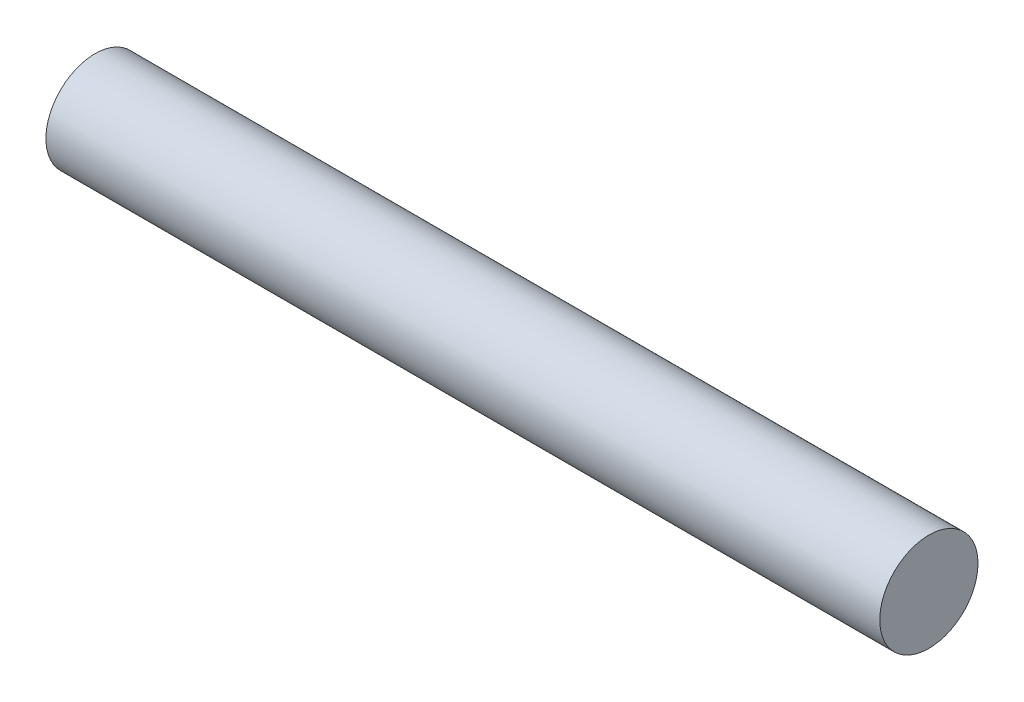
ISO-10303-21;
HEADER;
FILE_DESCRIPTION(('STEP AP214'),'2;1');
FILE_NAME('part.step','',(''),(''),'','','');
FILE_SCHEMA(('AUTOMOTIVE_DESIGN { 1 0 10303 214 1 1 1 1 }'));
ENDSEC;
DATA;
#1=APPLICATION_CONTEXT('core data for automotive mechanical design processes');
#2=APPLICATION_PROTOCOL_DEFINITION('international standard','automotive_design',2000,#1);
#3=PRODUCT_CONTEXT('',#1,'mechanical');
#4=PRODUCT('Part','Part','',(#3));
#5=PRODUCT_RELATED_PRODUCT_CATEGORY('part','',(#4));
#6=PRODUCT_DEFINITION_FORMATION('','',#4);
#7=PRODUCT_DEFINITION_CONTEXT('part definition',#1,'design');
#8=PRODUCT_DEFINITION('design','',#6,#7);
#9=PRODUCT_DEFINITION_SHAPE('','',#8);
#10=(LENGTH_UNIT() NAMED_UNIT(*) SI_UNIT(.MILLI.,.METRE.));
#11=(NAMED_UNIT(*) PLANE_ANGLE_UNIT() SI_UNIT($,.RADIAN.));
#12=(NAMED_UNIT(*) SI_UNIT($,.STERADIAN.) SOLID_ANGLE_UNIT());
#13=UNCERTAINTY_MEASURE_WITH_UNIT(LENGTH_MEASURE(1.E-05),#10,'distance_accuracy_value','');
#14=(GEOMETRIC_REPRESENTATION_CONTEXT(3) GLOBAL_UNCERTAINTY_ASSIGNED_CONTEXT((#13)) GLOBAL_UNIT_ASSIGNED_CONTEXT((#10,
#11,#12)) REPRESENTATION_CONTEXT('',''));
#15=CARTESIAN_POINT('',(0.,0.,0.));
#16=DIRECTION('',(0.,0.,1.));
#17=DIRECTION('',(1.,0.,0.));
#18=AXIS2_PLACEMENT_3D('',#15,#16,#17);
#19=CARTESIAN_POINT('',(67.9,0.,0.));
#20=DIRECTION('',(-1.,0.,0.));
#21=DIRECTION('',(0.,0.,1.));
#22=AXIS2_PLACEMENT_3D('',#19,#20,#21);
#23=CYLINDRICAL_SURFACE('',#22,4.);
#24=CARTESIAN_POINT('',(67.9,0.,0.));
#25=DIRECTION('',(1.,0.,0.));
#26=DIRECTION('',(0.,0.,-1.));
#27=AXIS2_PLACEMENT_3D('',#24,#25,#26);
#28=CIRCLE('',#27,4.);
#29=CARTESIAN_POINT('',(67.9,0.,-4.));
#30=VERTEX_POINT('',#29);
#31=EDGE_CURVE('E10',#30,#30,#28,.T.);
#32=ORIENTED_EDGE('',*,*,#31,.F.);
#33=EDGE_LOOP('',(#32));
#34=FACE_BOUND('',#33,.T.);
#35=CARTESIAN_POINT('',(0.,0.,0.));
#36=DIRECTION('',(1.,0.,0.));
#37=DIRECTION('',(0.,0.,-1.));
#38=AXIS2_PLACEMENT_3D('',#35,#36,#37);
#39=CIRCLE('',#38,4.);
#40=CARTESIAN_POINT('',(0.,0.,-4.));
#41=VERTEX_POINT('',#40);
#42=EDGE_CURVE('E40',#41,#41,#39,.T.);
#43=ORIENTED_EDGE('',*,*,#42,.T.);
#44=EDGE_LOOP('',(#43));
#45=FACE_BOUND('',#44,.T.);
#46=ADVANCED_FACE('F37',(#34,#45),#23,.T.);
#47=CARTESIAN_POINT('',(67.9,0.,0.));
#48=DIRECTION('',(1.,0.,0.));
#49=DIRECTION('',(0.,0.,-1.));
#50=AXIS2_PLACEMENT_3D('',#47,#48,#49);
#51=PLANE('',#50);
#52=ORIENTED_EDGE('',*,*,#31,.T.);
#53=EDGE_LOOP('',(#52));
#54=FACE_BOUND('',#53,.T.);
#55=ADVANCED_FACE('F52',(#54),#51,.T.);
#56=CARTESIAN_POINT('',(0.,0.,0.));
#57=DIRECTION('',(1.,0.,0.));
#58=DIRECTION('',(0.,0.,-1.));
#59=AXIS2_PLACEMENT_3D('',#56,#57,#58);
#60=PLANE('',#59);
#61=ORIENTED_EDGE('',*,*,#42,.F.);
#62=EDGE_LOOP('',(#61));
#63=FACE_BOUND('',#62,.T.);
#64=ADVANCED_FACE('F50',(#63),#60,.F.);
#65=CLOSED_SHELL('',(#46,#55,#64));
#66=MANIFOLD_SOLID_BREP('B2',#65);
#67=ADVANCED_BREP_SHAPE_REPRESENTATION('',(#18,#66),#14);
#68=SHAPE_DEFINITION_REPRESENTATION(#9,#67);
ENDSEC;
END-ISO-10303-21;
